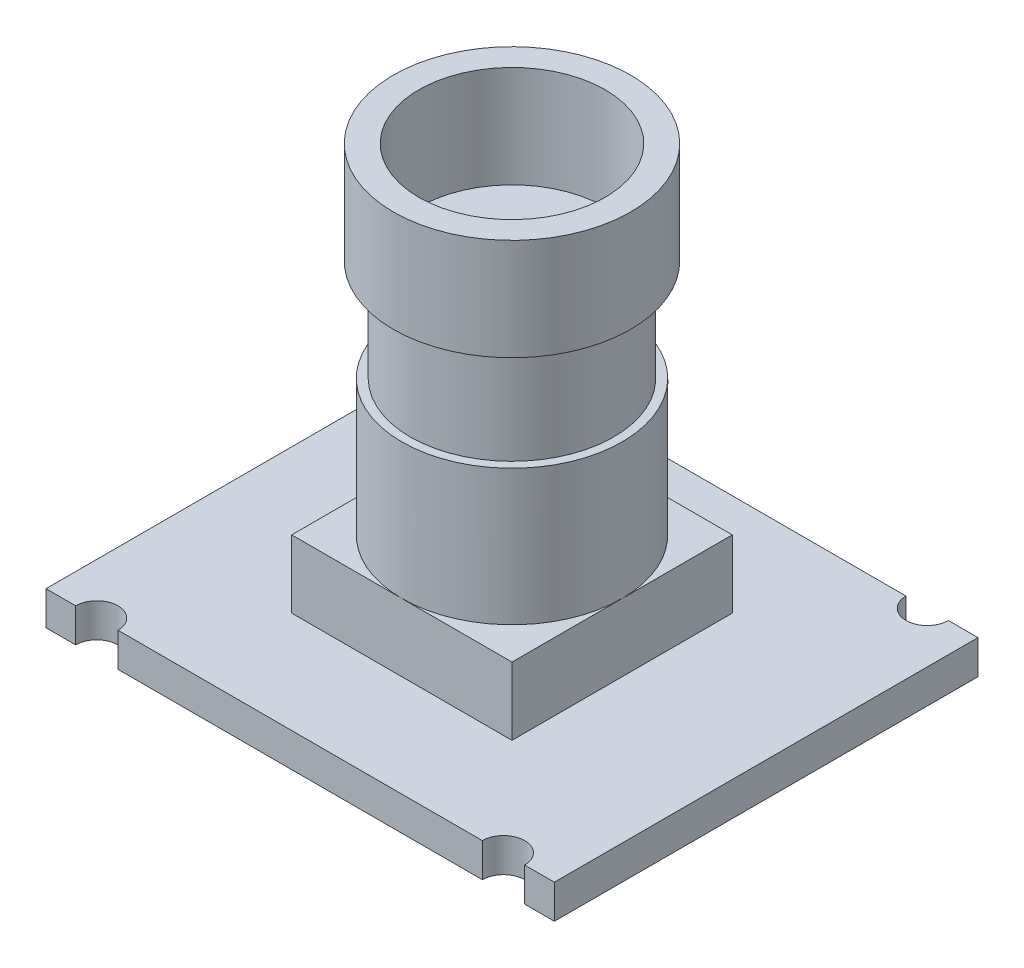
ISO-10303-21;
HEADER;
FILE_DESCRIPTION(('STEP AP214'),'2;1');
FILE_NAME('part.step','',(''),(''),'','','');
FILE_SCHEMA(('AUTOMOTIVE_DESIGN { 1 0 10303 214 1 1 1 1 }'));
ENDSEC;
DATA;
#1=APPLICATION_CONTEXT('core data for automotive mechanical design processes');
#2=APPLICATION_PROTOCOL_DEFINITION('international standard','automotive_design',2000,#1);
#3=PRODUCT_CONTEXT('',#1,'mechanical');
#4=PRODUCT('Part','Part','',(#3));
#5=PRODUCT_RELATED_PRODUCT_CATEGORY('part','',(#4));
#6=PRODUCT_DEFINITION_FORMATION('','',#4);
#7=PRODUCT_DEFINITION_CONTEXT('part definition',#1,'design');
#8=PRODUCT_DEFINITION('design','',#6,#7);
#9=PRODUCT_DEFINITION_SHAPE('','',#8);
#10=(LENGTH_UNIT() NAMED_UNIT(*) SI_UNIT(.MILLI.,.METRE.));
#11=(NAMED_UNIT(*) PLANE_ANGLE_UNIT() SI_UNIT($,.RADIAN.));
#12=(NAMED_UNIT(*) SI_UNIT($,.STERADIAN.) SOLID_ANGLE_UNIT());
#13=UNCERTAINTY_MEASURE_WITH_UNIT(LENGTH_MEASURE(1.E-05),#10,'distance_accuracy_value','');
#14=(GEOMETRIC_REPRESENTATION_CONTEXT(3) GLOBAL_UNCERTAINTY_ASSIGNED_CONTEXT((#13)) GLOBAL_UNIT_ASSIGNED_CONTEXT((#10,
#11,#12)) REPRESENTATION_CONTEXT('',''));
#15=CARTESIAN_POINT('',(0.,0.,0.));
#16=DIRECTION('',(0.,0.,1.));
#17=DIRECTION('',(1.,0.,0.));
#18=AXIS2_PLACEMENT_3D('',#15,#16,#17);
#19=CARTESIAN_POINT('',(0.,6.,0.));
#20=DIRECTION('',(0.,-1.,0.));
#21=DIRECTION('',(0.,0.,-1.));
#22=AXIS2_PLACEMENT_3D('',#19,#20,#21);
#23=PLANE('',#22);
#24=CARTESIAN_POINT('',(0.,6.,0.));
#25=DIRECTION('',(0.,1.,0.));
#26=DIRECTION('',(0.,0.,1.));
#27=AXIS2_PLACEMENT_3D('',#24,#25,#26);
#28=CIRCLE('',#27,6.5);
#29=CARTESIAN_POINT('',(0.,6.,6.5));
#30=VERTEX_POINT('',#29);
#31=CARTESIAN_POINT('',(6.5,6.,0.));
#32=VERTEX_POINT('',#31);
#33=EDGE_CURVE('E177',#30,#32,#28,.T.);
#34=ORIENTED_EDGE('',*,*,#33,.F.);
#35=DIRECTION('',(1.,0.,0.));
#36=VECTOR('',#35,1.);
#37=CARTESIAN_POINT('',(-6.5,6.,6.5));
#38=LINE('',#37,#36);
#39=CARTESIAN_POINT('',(6.5,6.,6.5));
#40=VERTEX_POINT('',#39);
#41=EDGE_CURVE('E165',#30,#40,#38,.T.);
#42=ORIENTED_EDGE('',*,*,#41,.T.);
#43=DIRECTION('',(0.,0.,-1.));
#44=VECTOR('',#43,1.);
#45=CARTESIAN_POINT('',(6.5,6.,6.5));
#46=LINE('',#45,#44);
#47=EDGE_CURVE('E178',#40,#32,#46,.T.);
#48=ORIENTED_EDGE('',*,*,#47,.T.);
#49=EDGE_LOOP('',(#34,#42,#48));
#50=FACE_BOUND('',#49,.T.);
#51=ADVANCED_FACE('F33',(#50),#23,.F.);
#52=CARTESIAN_POINT('',(0.,6.,-6.5));
#53=VERTEX_POINT('',#52);
#54=EDGE_CURVE('E41',#32,#53,#28,.T.);
#55=ORIENTED_EDGE('',*,*,#54,.F.);
#56=CARTESIAN_POINT('',(6.5,6.,-6.5));
#57=VERTEX_POINT('',#56);
#58=EDGE_CURVE('E193',#32,#57,#46,.T.);
#59=ORIENTED_EDGE('',*,*,#58,.T.);
#60=DIRECTION('',(-1.,0.,0.));
#61=VECTOR('',#60,1.);
#62=CARTESIAN_POINT('',(-6.5,6.,-6.5));
#63=LINE('',#62,#61);
#64=EDGE_CURVE('E194',#57,#53,#63,.T.);
#65=ORIENTED_EDGE('',*,*,#64,.T.);
#66=EDGE_LOOP('',(#55,#59,#65));
#67=FACE_BOUND('',#66,.T.);
#68=ADVANCED_FACE('F361',(#67),#23,.F.);
#69=CARTESIAN_POINT('',(-6.5,6.,0.));
#70=VERTEX_POINT('',#69);
#71=EDGE_CURVE('E56',#53,#70,#28,.T.);
#72=ORIENTED_EDGE('',*,*,#71,.F.);
#73=CARTESIAN_POINT('',(-6.5,6.,-6.5));
#74=VERTEX_POINT('',#73);
#75=EDGE_CURVE('E192',#53,#74,#63,.T.);
#76=ORIENTED_EDGE('',*,*,#75,.T.);
#77=DIRECTION('',(0.,0.,1.));
#78=VECTOR('',#77,1.);
#79=CARTESIAN_POINT('',(-6.5,6.,6.5));
#80=LINE('',#79,#78);
#81=EDGE_CURVE('E175',#74,#70,#80,.T.);
#82=ORIENTED_EDGE('',*,*,#81,.T.);
#83=EDGE_LOOP('',(#72,#76,#82));
#84=FACE_BOUND('',#83,.T.);
#85=ADVANCED_FACE('F366',(#84),#23,.F.);
#86=CARTESIAN_POINT('',(0.,2.,0.));
#87=DIRECTION('',(0.,-1.,0.));
#88=DIRECTION('',(0.,0.,-1.));
#89=AXIS2_PLACEMENT_3D('',#86,#87,#88);
#90=PLANE('',#89);
#91=CARTESIAN_POINT('',(12.,2.,12.5));
#92=DIRECTION('',(0.,-1.,0.));
#93=DIRECTION('',(0.,0.,1.));
#94=AXIS2_PLACEMENT_3D('',#91,#92,#93);
#95=CIRCLE('',#94,1.25);
#96=CARTESIAN_POINT('',(10.75,2.,12.5));
#97=VERTEX_POINT('',#96);
#98=CARTESIAN_POINT('',(13.25,2.,12.5));
#99=VERTEX_POINT('',#98);
#100=EDGE_CURVE('E218',#97,#99,#95,.T.);
#101=ORIENTED_EDGE('',*,*,#100,.T.);
#102=DIRECTION('',(1.,0.,0.));
#103=VECTOR('',#102,1.);
#104=CARTESIAN_POINT('',(-15.,2.,12.5));
#105=LINE('',#104,#103);
#106=CARTESIAN_POINT('',(15.,2.,12.5));
#107=VERTEX_POINT('',#106);
#108=EDGE_CURVE('E266',#99,#107,#105,.T.);
#109=ORIENTED_EDGE('',*,*,#108,.T.);
#110=DIRECTION('',(0.,0.,-1.));
#111=VECTOR('',#110,1.);
#112=CARTESIAN_POINT('',(15.,2.,12.5));
#113=LINE('',#112,#111);
#114=CARTESIAN_POINT('',(15.,2.,-12.5));
#115=VERTEX_POINT('',#114);
#116=EDGE_CURVE('E255',#107,#115,#113,.T.);
#117=ORIENTED_EDGE('',*,*,#116,.T.);
#118=DIRECTION('',(-1.,0.,0.));
#119=VECTOR('',#118,1.);
#120=CARTESIAN_POINT('',(-15.,2.,-12.5));
#121=LINE('',#120,#119);
#122=CARTESIAN_POINT('',(13.25,2.,-12.5));
#123=VERTEX_POINT('',#122);
#124=EDGE_CURVE('E260',#115,#123,#121,.T.);
#125=ORIENTED_EDGE('',*,*,#124,.T.);
#126=CARTESIAN_POINT('',(12.,2.,-12.5));
#127=DIRECTION('',(0.,-1.,0.));
#128=DIRECTION('',(0.,0.,1.));
#129=AXIS2_PLACEMENT_3D('',#126,#127,#128);
#130=CIRCLE('',#129,1.25);
#131=CARTESIAN_POINT('',(10.75,2.,-12.5));
#132=VERTEX_POINT('',#131);
#133=EDGE_CURVE('E227',#123,#132,#130,.T.);
#134=ORIENTED_EDGE('',*,*,#133,.T.);
#135=CARTESIAN_POINT('',(-10.75,2.,-12.5));
#136=VERTEX_POINT('',#135);
#137=EDGE_CURVE('E264',#132,#136,#121,.T.);
#138=ORIENTED_EDGE('',*,*,#137,.T.);
#139=CARTESIAN_POINT('',(-12.,2.,-12.5));
#140=DIRECTION('',(0.,1.,0.));
#141=DIRECTION('',(0.,0.,1.));
#142=AXIS2_PLACEMENT_3D('',#139,#140,#141);
#143=CIRCLE('',#142,1.25);
#144=CARTESIAN_POINT('',(-13.25,2.,-12.5));
#145=VERTEX_POINT('',#144);
#146=EDGE_CURVE('E245',#145,#136,#143,.T.);
#147=ORIENTED_EDGE('',*,*,#146,.F.);
#148=CARTESIAN_POINT('',(-15.,2.,-12.5));
#149=VERTEX_POINT('',#148);
#150=EDGE_CURVE('E258',#145,#149,#121,.T.);
#151=ORIENTED_EDGE('',*,*,#150,.T.);
#152=DIRECTION('',(0.,0.,1.));
#153=VECTOR('',#152,1.);
#154=CARTESIAN_POINT('',(-15.,2.,12.5));
#155=LINE('',#154,#153);
#156=CARTESIAN_POINT('',(-15.,2.,12.5));
#157=VERTEX_POINT('',#156);
#158=EDGE_CURVE('E263',#149,#157,#155,.T.);
#159=ORIENTED_EDGE('',*,*,#158,.T.);
#160=CARTESIAN_POINT('',(-13.25,2.,12.5));
#161=VERTEX_POINT('',#160);
#162=EDGE_CURVE('E267',#157,#161,#105,.T.);
#163=ORIENTED_EDGE('',*,*,#162,.T.);
#164=CARTESIAN_POINT('',(-12.,2.,12.5));
#165=DIRECTION('',(0.,1.,0.));
#166=DIRECTION('',(0.,0.,1.));
#167=AXIS2_PLACEMENT_3D('',#164,#165,#166);
#168=CIRCLE('',#167,1.25);
#169=CARTESIAN_POINT('',(-10.75,2.,12.5));
#170=VERTEX_POINT('',#169);
#171=EDGE_CURVE('E234',#170,#161,#168,.T.);
#172=ORIENTED_EDGE('',*,*,#171,.F.);
#173=EDGE_CURVE('E271',#170,#97,#105,.T.);
#174=ORIENTED_EDGE('',*,*,#173,.T.);
#175=EDGE_LOOP('',(#101,#109,#117,#125,#134,#138,#147,#151,#159,#163,#172,#174));
#176=FACE_BOUND('',#175,.T.);
#177=DIRECTION('',(0.,0.,-1.));
#178=VECTOR('',#177,1.);
#179=CARTESIAN_POINT('',(6.5,2.,6.5));
#180=LINE('',#179,#178);
#181=CARTESIAN_POINT('',(6.5,2.,6.5));
#182=VERTEX_POINT('',#181);
#183=CARTESIAN_POINT('',(6.5,2.,-6.5));
#184=VERTEX_POINT('',#183);
#185=EDGE_CURVE('E198',#182,#184,#180,.T.);
#186=ORIENTED_EDGE('',*,*,#185,.F.);
#187=DIRECTION('',(1.,0.,0.));
#188=VECTOR('',#187,1.);
#189=CARTESIAN_POINT('',(-6.5,2.,6.5));
#190=LINE('',#189,#188);
#191=CARTESIAN_POINT('',(-6.5,2.,6.5));
#192=VERTEX_POINT('',#191);
#193=EDGE_CURVE('E207',#192,#182,#190,.T.);
#194=ORIENTED_EDGE('',*,*,#193,.F.);
#195=DIRECTION('',(0.,0.,1.));
#196=VECTOR('',#195,1.);
#197=CARTESIAN_POINT('',(-6.5,2.,6.5));
#198=LINE('',#197,#196);
#199=CARTESIAN_POINT('',(-6.5,2.,-6.5));
#200=VERTEX_POINT('',#199);
#201=EDGE_CURVE('E204',#200,#192,#198,.T.);
#202=ORIENTED_EDGE('',*,*,#201,.F.);
#203=DIRECTION('',(-1.,0.,0.));
#204=VECTOR('',#203,1.);
#205=CARTESIAN_POINT('',(-6.5,2.,-6.5));
#206=LINE('',#205,#204);
#207=EDGE_CURVE('E201',#184,#200,#206,.T.);
#208=ORIENTED_EDGE('',*,*,#207,.F.);
#209=EDGE_LOOP('',(#186,#194,#202,#208));
#210=FACE_BOUND('',#209,.T.);
#211=ADVANCED_FACE('F344',(#176,#210),#90,.F.);
#212=CARTESIAN_POINT('',(-15.,2.,12.5));
#213=DIRECTION('',(0.,0.,-1.));
#214=DIRECTION('',(-1.,0.,0.));
#215=AXIS2_PLACEMENT_3D('',#212,#213,#214);
#216=PLANE('',#215);
#217=DIRECTION('',(0.,1.,0.));
#218=VECTOR('',#217,1.);
#219=CARTESIAN_POINT('',(10.75,0.,12.5));
#220=LINE('',#219,#218);
#221=CARTESIAN_POINT('',(10.75,0.,12.5));
#222=VERTEX_POINT('',#221);
#223=EDGE_CURVE('E225',#97,#222,#220,.F.);
#224=ORIENTED_EDGE('',*,*,#223,.F.);
#225=ORIENTED_EDGE('',*,*,#173,.F.);
#226=DIRECTION('',(0.,1.,0.));
#227=VECTOR('',#226,1.);
#228=CARTESIAN_POINT('',(-10.75,0.,12.5));
#229=LINE('',#228,#227);
#230=CARTESIAN_POINT('',(-10.75,0.,12.5));
#231=VERTEX_POINT('',#230);
#232=EDGE_CURVE('E238',#170,#231,#229,.F.);
#233=ORIENTED_EDGE('',*,*,#232,.T.);
#234=DIRECTION('',(1.,0.,0.));
#235=VECTOR('',#234,1.);
#236=CARTESIAN_POINT('',(-15.,0.,12.5));
#237=LINE('',#236,#235);
#238=EDGE_CURVE('E284',#231,#222,#237,.T.);
#239=ORIENTED_EDGE('',*,*,#238,.T.);
#240=EDGE_LOOP('',(#224,#225,#233,#239));
#241=FACE_BOUND('',#240,.T.);
#242=ADVANCED_FACE('F332',(#241),#216,.F.);
#243=DIRECTION('',(0.,1.,0.));
#244=VECTOR('',#243,1.);
#245=CARTESIAN_POINT('',(13.25,0.,12.5));
#246=LINE('',#245,#244);
#247=CARTESIAN_POINT('',(13.25,0.,12.5));
#248=VERTEX_POINT('',#247);
#249=EDGE_CURVE('E221',#248,#99,#246,.T.);
#250=ORIENTED_EDGE('',*,*,#249,.F.);
#251=CARTESIAN_POINT('',(15.,0.,12.5));
#252=VERTEX_POINT('',#251);
#253=EDGE_CURVE('E281',#248,#252,#237,.T.);
#254=ORIENTED_EDGE('',*,*,#253,.T.);
#255=DIRECTION('',(0.,-1.,0.));
#256=VECTOR('',#255,1.);
#257=CARTESIAN_POINT('',(15.,2.,12.5));
#258=LINE('',#257,#256);
#259=EDGE_CURVE('E270',#107,#252,#258,.T.);
#260=ORIENTED_EDGE('',*,*,#259,.F.);
#261=ORIENTED_EDGE('',*,*,#108,.F.);
#262=EDGE_LOOP('',(#250,#254,#260,#261));
#263=FACE_BOUND('',#262,.T.);
#264=ADVANCED_FACE('F386',(#263),#216,.F.);
#265=CARTESIAN_POINT('',(-15.,2.,-12.5));
#266=DIRECTION('',(0.,0.,1.));
#267=DIRECTION('',(1.,0.,0.));
#268=AXIS2_PLACEMENT_3D('',#265,#266,#267);
#269=PLANE('',#268);
#270=DIRECTION('',(0.,1.,0.));
#271=VECTOR('',#270,1.);
#272=CARTESIAN_POINT('',(13.25,0.,-12.5));
#273=LINE('',#272,#271);
#274=CARTESIAN_POINT('',(13.25,0.,-12.5));
#275=VERTEX_POINT('',#274);
#276=EDGE_CURVE('E232',#123,#275,#273,.F.);
#277=ORIENTED_EDGE('',*,*,#276,.F.);
#278=ORIENTED_EDGE('',*,*,#124,.F.);
#279=DIRECTION('',(0.,-1.,0.));
#280=VECTOR('',#279,1.);
#281=CARTESIAN_POINT('',(15.,2.,-12.5));
#282=LINE('',#281,#280);
#283=CARTESIAN_POINT('',(15.,0.,-12.5));
#284=VERTEX_POINT('',#283);
#285=EDGE_CURVE('E293',#115,#284,#282,.T.);
#286=ORIENTED_EDGE('',*,*,#285,.T.);
#287=DIRECTION('',(-1.,0.,0.));
#288=VECTOR('',#287,1.);
#289=CARTESIAN_POINT('',(-15.,0.,-12.5));
#290=LINE('',#289,#288);
#291=EDGE_CURVE('E275',#284,#275,#290,.T.);
#292=ORIENTED_EDGE('',*,*,#291,.T.);
#293=EDGE_LOOP('',(#277,#278,#286,#292));
#294=FACE_BOUND('',#293,.T.);
#295=ADVANCED_FACE('F320',(#294),#269,.F.);
#296=DIRECTION('',(0.,1.,0.));
#297=VECTOR('',#296,1.);
#298=CARTESIAN_POINT('',(10.75,0.,-12.5));
#299=LINE('',#298,#297);
#300=CARTESIAN_POINT('',(10.75,0.,-12.5));
#301=VERTEX_POINT('',#300);
#302=EDGE_CURVE('E230',#301,#132,#299,.T.);
#303=ORIENTED_EDGE('',*,*,#302,.F.);
#304=CARTESIAN_POINT('',(-10.75,0.,-12.5));
#305=VERTEX_POINT('',#304);
#306=EDGE_CURVE('E279',#301,#305,#290,.T.);
#307=ORIENTED_EDGE('',*,*,#306,.T.);
#308=DIRECTION('',(0.,1.,0.));
#309=VECTOR('',#308,1.);
#310=CARTESIAN_POINT('',(-10.75,0.,-12.5));
#311=LINE('',#310,#309);
#312=EDGE_CURVE('E251',#305,#136,#311,.T.);
#313=ORIENTED_EDGE('',*,*,#312,.T.);
#314=ORIENTED_EDGE('',*,*,#137,.F.);
#315=EDGE_LOOP('',(#303,#307,#313,#314));
#316=FACE_BOUND('',#315,.T.);
#317=ADVANCED_FACE('F314',(#316),#269,.F.);
#318=CARTESIAN_POINT('',(-15.,0.,12.5));
#319=VERTEX_POINT('',#318);
#320=CARTESIAN_POINT('',(-13.25,0.,12.5));
#321=VERTEX_POINT('',#320);
#322=EDGE_CURVE('E259',#319,#321,#237,.T.);
#323=ORIENTED_EDGE('',*,*,#322,.T.);
#324=DIRECTION('',(0.,1.,0.));
#325=VECTOR('',#324,1.);
#326=CARTESIAN_POINT('',(-13.25,0.,12.5));
#327=LINE('',#326,#325);
#328=EDGE_CURVE('E242',#321,#161,#327,.T.);
#329=ORIENTED_EDGE('',*,*,#328,.T.);
#330=ORIENTED_EDGE('',*,*,#162,.F.);
#331=DIRECTION('',(0.,-1.,0.));
#332=VECTOR('',#331,1.);
#333=CARTESIAN_POINT('',(-15.,2.,12.5));
#334=LINE('',#333,#332);
#335=EDGE_CURVE('E287',#157,#319,#334,.T.);
#336=ORIENTED_EDGE('',*,*,#335,.T.);
#337=EDGE_LOOP('',(#323,#329,#330,#336));
#338=FACE_BOUND('',#337,.T.);
#339=ADVANCED_FACE('F337',(#338),#216,.F.);
#340=CARTESIAN_POINT('',(15.,2.,12.5));
#341=DIRECTION('',(-1.,0.,0.));
#342=DIRECTION('',(0.,0.,1.));
#343=AXIS2_PLACEMENT_3D('',#340,#341,#342);
#344=PLANE('',#343);
#345=DIRECTION('',(0.,0.,-1.));
#346=VECTOR('',#345,1.);
#347=CARTESIAN_POINT('',(15.,0.,12.5));
#348=LINE('',#347,#346);
#349=EDGE_CURVE('E254',#252,#284,#348,.T.);
#350=ORIENTED_EDGE('',*,*,#349,.T.);
#351=ORIENTED_EDGE('',*,*,#285,.F.);
#352=ORIENTED_EDGE('',*,*,#116,.F.);
#353=ORIENTED_EDGE('',*,*,#259,.T.);
#354=EDGE_LOOP('',(#350,#351,#352,#353));
#355=FACE_BOUND('',#354,.T.);
#356=ADVANCED_FACE('F35',(#355),#344,.F.);
#357=ORIENTED_EDGE('',*,*,#150,.F.);
#358=DIRECTION('',(0.,1.,0.));
#359=VECTOR('',#358,1.);
#360=CARTESIAN_POINT('',(-13.25,0.,-12.5));
#361=LINE('',#360,#359);
#362=CARTESIAN_POINT('',(-13.25,0.,-12.5));
#363=VERTEX_POINT('',#362);
#364=EDGE_CURVE('E248',#145,#363,#361,.F.);
#365=ORIENTED_EDGE('',*,*,#364,.T.);
#366=CARTESIAN_POINT('',(-15.,0.,-12.5));
#367=VERTEX_POINT('',#366);
#368=EDGE_CURVE('E274',#363,#367,#290,.T.);
#369=ORIENTED_EDGE('',*,*,#368,.T.);
#370=DIRECTION('',(0.,-1.,0.));
#371=VECTOR('',#370,1.);
#372=CARTESIAN_POINT('',(-15.,2.,-12.5));
#373=LINE('',#372,#371);
#374=EDGE_CURVE('E290',#149,#367,#373,.T.);
#375=ORIENTED_EDGE('',*,*,#374,.F.);
#376=EDGE_LOOP('',(#357,#365,#369,#375));
#377=FACE_BOUND('',#376,.T.);
#378=ADVANCED_FACE('F306',(#377),#269,.F.);
#379=CARTESIAN_POINT('',(-15.,2.,12.5));
#380=DIRECTION('',(1.,0.,0.));
#381=DIRECTION('',(0.,0.,-1.));
#382=AXIS2_PLACEMENT_3D('',#379,#380,#381);
#383=PLANE('',#382);
#384=DIRECTION('',(0.,0.,1.));
#385=VECTOR('',#384,1.);
#386=CARTESIAN_POINT('',(-15.,0.,12.5));
#387=LINE('',#386,#385);
#388=EDGE_CURVE('E278',#367,#319,#387,.T.);
#389=ORIENTED_EDGE('',*,*,#388,.T.);
#390=ORIENTED_EDGE('',*,*,#335,.F.);
#391=ORIENTED_EDGE('',*,*,#158,.F.);
#392=ORIENTED_EDGE('',*,*,#374,.T.);
#393=EDGE_LOOP('',(#389,#390,#391,#392));
#394=FACE_BOUND('',#393,.T.);
#395=ADVANCED_FACE('F342',(#394),#383,.F.);
#396=CARTESIAN_POINT('',(0.,0.,0.));
#397=DIRECTION('',(0.,-1.,0.));
#398=DIRECTION('',(0.,0.,-1.));
#399=AXIS2_PLACEMENT_3D('',#396,#397,#398);
#400=PLANE('',#399);
#401=ORIENTED_EDGE('',*,*,#253,.F.);
#402=CARTESIAN_POINT('',(12.,0.,12.5));
#403=DIRECTION('',(0.,-1.,0.));
#404=DIRECTION('',(0.,0.,1.));
#405=AXIS2_PLACEMENT_3D('',#402,#403,#404);
#406=CIRCLE('',#405,1.25);
#407=EDGE_CURVE('E219',#222,#248,#406,.T.);
#408=ORIENTED_EDGE('',*,*,#407,.F.);
#409=ORIENTED_EDGE('',*,*,#238,.F.);
#410=CARTESIAN_POINT('',(-12.,0.,12.5));
#411=DIRECTION('',(0.,1.,0.));
#412=DIRECTION('',(0.,0.,1.));
#413=AXIS2_PLACEMENT_3D('',#410,#411,#412);
#414=CIRCLE('',#413,1.25);
#415=EDGE_CURVE('E235',#231,#321,#414,.T.);
#416=ORIENTED_EDGE('',*,*,#415,.T.);
#417=ORIENTED_EDGE('',*,*,#322,.F.);
#418=ORIENTED_EDGE('',*,*,#388,.F.);
#419=ORIENTED_EDGE('',*,*,#368,.F.);
#420=CARTESIAN_POINT('',(-12.,0.,-12.5));
#421=DIRECTION('',(0.,-1.,0.));
#422=DIRECTION('',(0.,0.,-1.));
#423=AXIS2_PLACEMENT_3D('',#420,#421,#422);
#424=CIRCLE('',#423,1.25);
#425=EDGE_CURVE('E187',#305,#363,#424,.T.);
#426=ORIENTED_EDGE('',*,*,#425,.F.);
#427=ORIENTED_EDGE('',*,*,#306,.F.);
#428=CARTESIAN_POINT('',(12.,0.,-12.5));
#429=DIRECTION('',(0.,-1.,0.));
#430=DIRECTION('',(0.,0.,-1.));
#431=AXIS2_PLACEMENT_3D('',#428,#429,#430);
#432=CIRCLE('',#431,1.25);
#433=EDGE_CURVE('E185',#301,#275,#432,.F.);
#434=ORIENTED_EDGE('',*,*,#433,.T.);
#435=ORIENTED_EDGE('',*,*,#291,.F.);
#436=ORIENTED_EDGE('',*,*,#349,.F.);
#437=EDGE_LOOP('',(#401,#408,#409,#416,#417,#418,#419,#426,#427,#434,#435,#436));
#438=FACE_BOUND('',#437,.T.);
#439=ADVANCED_FACE('F310',(#438),#400,.T.);
#440=CARTESIAN_POINT('',(-12.,0.,-12.5));
#441=DIRECTION('',(0.,1.,0.));
#442=DIRECTION('',(0.,0.,1.));
#443=AXIS2_PLACEMENT_3D('',#440,#441,#442);
#444=CYLINDRICAL_SURFACE('',#443,1.25);
#445=ORIENTED_EDGE('',*,*,#425,.T.);
#446=ORIENTED_EDGE('',*,*,#364,.F.);
#447=ORIENTED_EDGE('',*,*,#146,.T.);
#448=ORIENTED_EDGE('',*,*,#312,.F.);
#449=EDGE_LOOP('',(#445,#446,#447,#448));
#450=FACE_BOUND('',#449,.T.);
#451=ADVANCED_FACE('F299',(#450),#444,.F.);
#452=CARTESIAN_POINT('',(-12.,0.,12.5));
#453=DIRECTION('',(0.,1.,0.));
#454=DIRECTION('',(0.,0.,1.));
#455=AXIS2_PLACEMENT_3D('',#452,#453,#454);
#456=CYLINDRICAL_SURFACE('',#455,1.25);
#457=ORIENTED_EDGE('',*,*,#415,.F.);
#458=ORIENTED_EDGE('',*,*,#232,.F.);
#459=ORIENTED_EDGE('',*,*,#171,.T.);
#460=ORIENTED_EDGE('',*,*,#328,.F.);
#461=EDGE_LOOP('',(#457,#458,#459,#460));
#462=FACE_BOUND('',#461,.T.);
#463=ADVANCED_FACE('F350',(#462),#456,.F.);
#464=CARTESIAN_POINT('',(12.,0.,-12.5));
#465=DIRECTION('',(0.,1.,0.));
#466=DIRECTION('',(0.,0.,1.));
#467=AXIS2_PLACEMENT_3D('',#464,#465,#466);
#468=CYLINDRICAL_SURFACE('',#467,1.25);
#469=ORIENTED_EDGE('',*,*,#276,.T.);
#470=ORIENTED_EDGE('',*,*,#433,.F.);
#471=ORIENTED_EDGE('',*,*,#302,.T.);
#472=ORIENTED_EDGE('',*,*,#133,.F.);
#473=EDGE_LOOP('',(#469,#470,#471,#472));
#474=FACE_BOUND('',#473,.T.);
#475=ADVANCED_FACE('F347',(#474),#468,.F.);
#476=CARTESIAN_POINT('',(12.,0.,12.5));
#477=DIRECTION('',(0.,1.,0.));
#478=DIRECTION('',(0.,0.,1.));
#479=AXIS2_PLACEMENT_3D('',#476,#477,#478);
#480=CYLINDRICAL_SURFACE('',#479,1.25);
#481=ORIENTED_EDGE('',*,*,#223,.T.);
#482=ORIENTED_EDGE('',*,*,#407,.T.);
#483=ORIENTED_EDGE('',*,*,#249,.T.);
#484=ORIENTED_EDGE('',*,*,#100,.F.);
#485=EDGE_LOOP('',(#481,#482,#483,#484));
#486=FACE_BOUND('',#485,.T.);
#487=ADVANCED_FACE('F349',(#486),#480,.F.);
#488=CARTESIAN_POINT('',(6.5,6.,6.5));
#489=DIRECTION('',(-1.,0.,0.));
#490=DIRECTION('',(0.,0.,1.));
#491=AXIS2_PLACEMENT_3D('',#488,#489,#490);
#492=PLANE('',#491);
#493=ORIENTED_EDGE('',*,*,#185,.T.);
#494=DIRECTION('',(0.,-1.,0.));
#495=VECTOR('',#494,1.);
#496=CARTESIAN_POINT('',(6.5,6.,-6.5));
#497=LINE('',#496,#495);
#498=EDGE_CURVE('E215',#57,#184,#497,.T.);
#499=ORIENTED_EDGE('',*,*,#498,.F.);
#500=ORIENTED_EDGE('',*,*,#58,.F.);
#501=ORIENTED_EDGE('',*,*,#47,.F.);
#502=DIRECTION('',(0.,-1.,0.));
#503=VECTOR('',#502,1.);
#504=CARTESIAN_POINT('',(6.5,6.,6.5));
#505=LINE('',#504,#503);
#506=EDGE_CURVE('E164',#40,#182,#505,.T.);
#507=ORIENTED_EDGE('',*,*,#506,.T.);
#508=EDGE_LOOP('',(#493,#499,#500,#501,#507));
#509=FACE_BOUND('',#508,.T.);
#510=ADVANCED_FACE('F356',(#509),#492,.F.);
#511=CARTESIAN_POINT('',(-6.5,6.,-6.5));
#512=DIRECTION('',(0.,0.,1.));
#513=DIRECTION('',(1.,0.,0.));
#514=AXIS2_PLACEMENT_3D('',#511,#512,#513);
#515=PLANE('',#514);
#516=ORIENTED_EDGE('',*,*,#207,.T.);
#517=DIRECTION('',(0.,-1.,0.));
#518=VECTOR('',#517,1.);
#519=CARTESIAN_POINT('',(-6.5,6.,-6.5));
#520=LINE('',#519,#518);
#521=EDGE_CURVE('E212',#74,#200,#520,.T.);
#522=ORIENTED_EDGE('',*,*,#521,.F.);
#523=ORIENTED_EDGE('',*,*,#75,.F.);
#524=ORIENTED_EDGE('',*,*,#64,.F.);
#525=ORIENTED_EDGE('',*,*,#498,.T.);
#526=EDGE_LOOP('',(#516,#522,#523,#524,#525));
#527=FACE_BOUND('',#526,.T.);
#528=ADVANCED_FACE('F468',(#527),#515,.F.);
#529=CARTESIAN_POINT('',(-6.5,6.,6.5));
#530=DIRECTION('',(1.,0.,0.));
#531=DIRECTION('',(0.,0.,-1.));
#532=AXIS2_PLACEMENT_3D('',#529,#530,#531);
#533=PLANE('',#532);
#534=ORIENTED_EDGE('',*,*,#201,.T.);
#535=DIRECTION('',(0.,-1.,0.));
#536=VECTOR('',#535,1.);
#537=CARTESIAN_POINT('',(-6.5,6.,6.5));
#538=LINE('',#537,#536);
#539=CARTESIAN_POINT('',(-6.5,6.,6.5));
#540=VERTEX_POINT('',#539);
#541=EDGE_CURVE('E210',#540,#192,#538,.T.);
#542=ORIENTED_EDGE('',*,*,#541,.F.);
#543=EDGE_CURVE('E160',#70,#540,#80,.T.);
#544=ORIENTED_EDGE('',*,*,#543,.F.);
#545=ORIENTED_EDGE('',*,*,#81,.F.);
#546=ORIENTED_EDGE('',*,*,#521,.T.);
#547=EDGE_LOOP('',(#534,#542,#544,#545,#546));
#548=FACE_BOUND('',#547,.T.);
#549=ADVANCED_FACE('F377',(#548),#533,.F.);
#550=CARTESIAN_POINT('',(-6.5,6.,6.5));
#551=DIRECTION('',(0.,0.,-1.));
#552=DIRECTION('',(-1.,0.,0.));
#553=AXIS2_PLACEMENT_3D('',#550,#551,#552);
#554=PLANE('',#553);
#555=ORIENTED_EDGE('',*,*,#193,.T.);
#556=ORIENTED_EDGE('',*,*,#506,.F.);
#557=ORIENTED_EDGE('',*,*,#41,.F.);
#558=EDGE_CURVE('E157',#540,#30,#38,.T.);
#559=ORIENTED_EDGE('',*,*,#558,.F.);
#560=ORIENTED_EDGE('',*,*,#541,.T.);
#561=EDGE_LOOP('',(#555,#556,#557,#559,#560));
#562=FACE_BOUND('',#561,.T.);
#563=ADVANCED_FACE('F170',(#562),#554,.F.);
#564=EDGE_CURVE('E48',#70,#30,#28,.T.);
#565=ORIENTED_EDGE('',*,*,#564,.F.);
#566=ORIENTED_EDGE('',*,*,#543,.T.);
#567=ORIENTED_EDGE('',*,*,#558,.T.);
#568=EDGE_LOOP('',(#565,#566,#567));
#569=FACE_BOUND('',#568,.T.);
#570=ADVANCED_FACE('F159',(#569),#23,.F.);
#571=CARTESIAN_POINT('',(0.,14.,0.));
#572=DIRECTION('',(0.,-1.,0.));
#573=DIRECTION('',(0.,0.,-1.));
#574=AXIS2_PLACEMENT_3D('',#571,#572,#573);
#575=CYLINDRICAL_SURFACE('',#574,6.5);
#576=CARTESIAN_POINT('',(0.,14.,0.));
#577=DIRECTION('',(0.,1.,0.));
#578=DIRECTION('',(0.,0.,1.));
#579=AXIS2_PLACEMENT_3D('',#576,#577,#578);
#580=CIRCLE('',#579,6.5);
#581=CARTESIAN_POINT('',(0.,14.,6.5));
#582=VERTEX_POINT('',#581);
#583=EDGE_CURVE('E181',#582,#582,#580,.T.);
#584=ORIENTED_EDGE('',*,*,#583,.F.);
#585=EDGE_LOOP('',(#584));
#586=FACE_BOUND('',#585,.T.);
#587=ORIENTED_EDGE('',*,*,#33,.T.);
#588=ORIENTED_EDGE('',*,*,#54,.T.);
#589=ORIENTED_EDGE('',*,*,#71,.T.);
#590=ORIENTED_EDGE('',*,*,#564,.T.);
#591=EDGE_LOOP('',(#587,#588,#589,#590));
#592=FACE_BOUND('',#591,.T.);
#593=ADVANCED_FACE('F184',(#586,#592),#575,.T.);
#594=CARTESIAN_POINT('',(0.,14.,0.));
#595=DIRECTION('',(0.,1.,0.));
#596=DIRECTION('',(0.,0.,1.));
#597=AXIS2_PLACEMENT_3D('',#594,#595,#596);
#598=PLANE('',#597);
#599=CARTESIAN_POINT('',(0.,14.,0.));
#600=DIRECTION('',(0.,1.,0.));
#601=DIRECTION('',(0.,0.,1.));
#602=AXIS2_PLACEMENT_3D('',#599,#600,#601);
#603=CIRCLE('',#602,6.);
#604=CARTESIAN_POINT('',(0.,14.,6.));
#605=VERTEX_POINT('',#604);
#606=EDGE_CURVE('E587',#605,#605,#603,.T.);
#607=ORIENTED_EDGE('',*,*,#606,.F.);
#608=EDGE_LOOP('',(#607));
#609=FACE_BOUND('',#608,.T.);
#610=ORIENTED_EDGE('',*,*,#583,.T.);
#611=EDGE_LOOP('',(#610));
#612=FACE_BOUND('',#611,.T.);
#613=ADVANCED_FACE('F375',(#609,#612),#598,.T.);
#614=CARTESIAN_POINT('',(0.,20.,0.));
#615=DIRECTION('',(0.,-1.,0.));
#616=DIRECTION('',(0.,0.,-1.));
#617=AXIS2_PLACEMENT_3D('',#614,#615,#616);
#618=CYLINDRICAL_SURFACE('',#617,6.);
#619=CARTESIAN_POINT('',(0.,20.,0.));
#620=DIRECTION('',(0.,1.,0.));
#621=DIRECTION('',(0.,0.,1.));
#622=AXIS2_PLACEMENT_3D('',#619,#620,#621);
#623=CIRCLE('',#622,6.);
#624=CARTESIAN_POINT('',(0.,20.,6.));
#625=VERTEX_POINT('',#624);
#626=EDGE_CURVE('E182',#625,#625,#623,.T.);
#627=ORIENTED_EDGE('',*,*,#626,.F.);
#628=EDGE_LOOP('',(#627));
#629=FACE_BOUND('',#628,.T.);
#630=ORIENTED_EDGE('',*,*,#606,.T.);
#631=EDGE_LOOP('',(#630));
#632=FACE_BOUND('',#631,.T.);
#633=ADVANCED_FACE('F510',(#629,#632),#618,.T.);
#634=CARTESIAN_POINT('',(0.,26.,0.));
#635=DIRECTION('',(0.,1.,0.));
#636=DIRECTION('',(0.,0.,1.));
#637=AXIS2_PLACEMENT_3D('',#634,#635,#636);
#638=PLANE('',#637);
#639=CARTESIAN_POINT('',(0.,26.,0.));
#640=DIRECTION('',(0.,1.,0.));
#641=DIRECTION('',(0.,0.,1.));
#642=AXIS2_PLACEMENT_3D('',#639,#640,#641);
#643=CIRCLE('',#642,7.);
#644=CARTESIAN_POINT('',(0.,26.,7.));
#645=VERTEX_POINT('',#644);
#646=EDGE_CURVE('E583',#645,#645,#643,.T.);
#647=ORIENTED_EDGE('',*,*,#646,.T.);
#648=EDGE_LOOP('',(#647));
#649=FACE_BOUND('',#648,.T.);
#650=CARTESIAN_POINT('',(0.,26.,0.));
#651=DIRECTION('',(0.,1.,0.));
#652=DIRECTION('',(0.,0.,1.));
#653=AXIS2_PLACEMENT_3D('',#650,#651,#652);
#654=CIRCLE('',#653,5.5);
#655=CARTESIAN_POINT('',(0.,26.,5.5));
#656=VERTEX_POINT('',#655);
#657=EDGE_CURVE('E578',#656,#656,#654,.T.);
#658=ORIENTED_EDGE('',*,*,#657,.F.);
#659=EDGE_LOOP('',(#658));
#660=FACE_BOUND('',#659,.T.);
#661=ADVANCED_FACE('F520',(#649,#660),#638,.T.);
#662=CARTESIAN_POINT('',(0.,20.,0.));
#663=DIRECTION('',(0.,1.,0.));
#664=DIRECTION('',(0.,0.,1.));
#665=AXIS2_PLACEMENT_3D('',#662,#663,#664);
#666=PLANE('',#665);
#667=ORIENTED_EDGE('',*,*,#626,.T.);
#668=EDGE_LOOP('',(#667));
#669=FACE_BOUND('',#668,.T.);
#670=CARTESIAN_POINT('',(0.,20.,0.));
#671=DIRECTION('',(0.,1.,0.));
#672=DIRECTION('',(0.,0.,1.));
#673=AXIS2_PLACEMENT_3D('',#670,#671,#672);
#674=CIRCLE('',#673,7.);
#675=CARTESIAN_POINT('',(0.,20.,7.));
#676=VERTEX_POINT('',#675);
#677=EDGE_CURVE('E580',#676,#676,#674,.T.);
#678=ORIENTED_EDGE('',*,*,#677,.F.);
#679=EDGE_LOOP('',(#678));
#680=FACE_BOUND('',#679,.T.);
#681=ADVANCED_FACE('F531',(#669,#680),#666,.F.);
#682=CARTESIAN_POINT('',(0.,26.,0.));
#683=DIRECTION('',(0.,-1.,0.));
#684=DIRECTION('',(0.,0.,-1.));
#685=AXIS2_PLACEMENT_3D('',#682,#683,#684);
#686=CYLINDRICAL_SURFACE('',#685,7.);
#687=ORIENTED_EDGE('',*,*,#646,.F.);
#688=EDGE_LOOP('',(#687));
#689=FACE_BOUND('',#688,.T.);
#690=ORIENTED_EDGE('',*,*,#677,.T.);
#691=EDGE_LOOP('',(#690));
#692=FACE_BOUND('',#691,.T.);
#693=ADVANCED_FACE('F541',(#689,#692),#686,.T.);
#694=CARTESIAN_POINT('',(0.,26.,0.));
#695=DIRECTION('',(0.,-1.,0.));
#696=DIRECTION('',(0.,0.,-1.));
#697=AXIS2_PLACEMENT_3D('',#694,#695,#696);
#698=CYLINDRICAL_SURFACE('',#697,5.5);
#699=ORIENTED_EDGE('',*,*,#657,.T.);
#700=EDGE_LOOP('',(#699));
#701=FACE_BOUND('',#700,.T.);
#702=CARTESIAN_POINT('',(0.,20.,0.));
#703=DIRECTION('',(0.,1.,0.));
#704=DIRECTION('',(0.,0.,1.));
#705=AXIS2_PLACEMENT_3D('',#702,#703,#704);
#706=CIRCLE('',#705,5.5);
#707=CARTESIAN_POINT('',(0.,20.,5.5));
#708=VERTEX_POINT('',#707);
#709=EDGE_CURVE('E11',#708,#708,#706,.F.);
#710=ORIENTED_EDGE('',*,*,#709,.T.);
#711=EDGE_LOOP('',(#710));
#712=FACE_BOUND('',#711,.T.);
#713=ADVANCED_FACE('F551',(#701,#712),#698,.F.);
#714=CARTESIAN_POINT('',(0.,20.,0.));
#715=DIRECTION('',(0.,1.,0.));
#716=DIRECTION('',(0.,0.,1.));
#717=AXIS2_PLACEMENT_3D('',#714,#715,#716);
#718=PLANE('',#717);
#719=ORIENTED_EDGE('',*,*,#709,.F.);
#720=EDGE_LOOP('',(#719));
#721=FACE_BOUND('',#720,.T.);
#722=ADVANCED_FACE('F561',(#721),#718,.T.);
#723=CLOSED_SHELL('',(#51,#68,#85,#211,#242,#264,#295,#317,#339,#356,#378,#395,#439,#451,#463,
#475,#487,#510,#528,#549,#563,#570,#593,#613,#633,#661,#681,#693,#713,#722));
#724=MANIFOLD_SOLID_BREP('B2',#723);
#725=ADVANCED_BREP_SHAPE_REPRESENTATION('',(#18,#724),#14);
#726=SHAPE_DEFINITION_REPRESENTATION(#9,#725);
ENDSEC;
END-ISO-10303-21;
